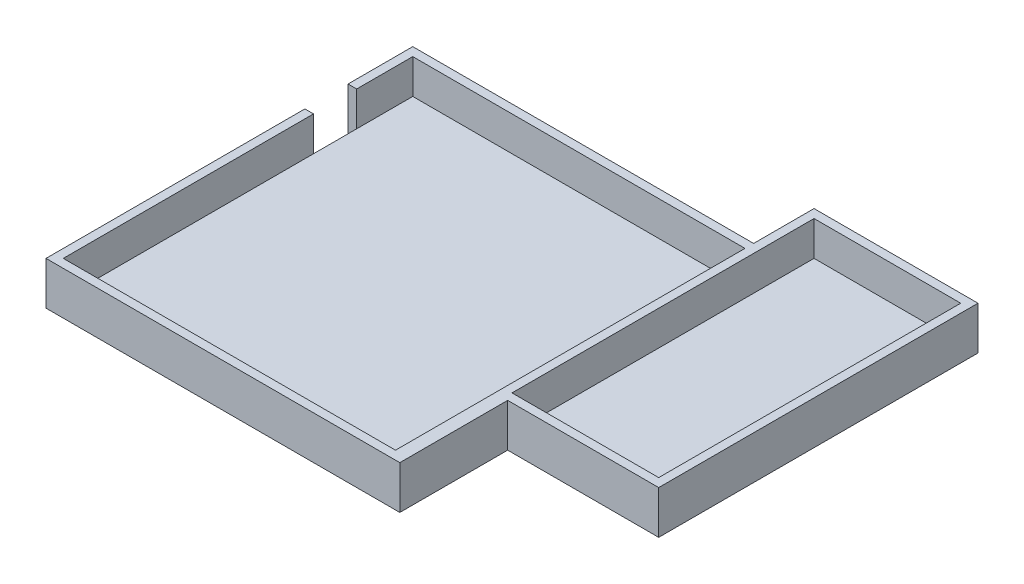
ISO-10303-21;
HEADER;
FILE_DESCRIPTION(('STEP AP214'),'2;1');
FILE_NAME('part.step','',(''),(''),'','','');
FILE_SCHEMA(('AUTOMOTIVE_DESIGN { 1 0 10303 214 1 1 1 1 }'));
ENDSEC;
DATA;
#1=APPLICATION_CONTEXT('core data for automotive mechanical design processes');
#2=APPLICATION_PROTOCOL_DEFINITION('international standard','automotive_design',2000,#1);
#3=PRODUCT_CONTEXT('',#1,'mechanical');
#4=PRODUCT('Part','Part','',(#3));
#5=PRODUCT_RELATED_PRODUCT_CATEGORY('part','',(#4));
#6=PRODUCT_DEFINITION_FORMATION('','',#4);
#7=PRODUCT_DEFINITION_CONTEXT('part definition',#1,'design');
#8=PRODUCT_DEFINITION('design','',#6,#7);
#9=PRODUCT_DEFINITION_SHAPE('','',#8);
#10=(LENGTH_UNIT() NAMED_UNIT(*) SI_UNIT(.MILLI.,.METRE.));
#11=(NAMED_UNIT(*) PLANE_ANGLE_UNIT() SI_UNIT($,.RADIAN.));
#12=(NAMED_UNIT(*) SI_UNIT($,.STERADIAN.) SOLID_ANGLE_UNIT());
#13=UNCERTAINTY_MEASURE_WITH_UNIT(LENGTH_MEASURE(1.E-05),#10,'distance_accuracy_value','');
#14=(GEOMETRIC_REPRESENTATION_CONTEXT(3) GLOBAL_UNCERTAINTY_ASSIGNED_CONTEXT((#13)) GLOBAL_UNIT_ASSIGNED_CONTEXT((#10,
#11,#12)) REPRESENTATION_CONTEXT('',''));
#15=CARTESIAN_POINT('',(0.,0.,0.));
#16=DIRECTION('',(0.,0.,1.));
#17=DIRECTION('',(1.,0.,0.));
#18=AXIS2_PLACEMENT_3D('',#15,#16,#17);
#19=CARTESIAN_POINT('',(-55.5,2.,-31.));
#20=DIRECTION('',(-1.,0.,0.));
#21=DIRECTION('',(0.,0.,1.));
#22=AXIS2_PLACEMENT_3D('',#19,#20,#21);
#23=PLANE('',#22);
#24=DIRECTION('',(0.,0.,1.));
#25=VECTOR('',#24,1.);
#26=CARTESIAN_POINT('',(-55.5,10.,-31.));
#27=LINE('',#26,#25);
#28=CARTESIAN_POINT('',(-55.5,10.,-31.));
#29=VERTEX_POINT('',#28);
#30=CARTESIAN_POINT('',(-55.5,10.,-18.));
#31=VERTEX_POINT('',#30);
#32=EDGE_CURVE('E267',#29,#31,#27,.T.);
#33=ORIENTED_EDGE('',*,*,#32,.T.);
#34=DIRECTION('',(0.,-1.,0.));
#35=VECTOR('',#34,1.);
#36=CARTESIAN_POINT('',(-55.5,10.,-18.));
#37=LINE('',#36,#35);
#38=CARTESIAN_POINT('',(-55.5,2.,-18.));
#39=VERTEX_POINT('',#38);
#40=EDGE_CURVE('E194',#31,#39,#37,.T.);
#41=ORIENTED_EDGE('',*,*,#40,.T.);
#42=DIRECTION('',(0.,0.,1.));
#43=VECTOR('',#42,1.);
#44=CARTESIAN_POINT('',(-55.5,2.,-31.));
#45=LINE('',#44,#43);
#46=CARTESIAN_POINT('',(-55.5,2.,-31.));
#47=VERTEX_POINT('',#46);
#48=EDGE_CURVE('E253',#47,#39,#45,.T.);
#49=ORIENTED_EDGE('',*,*,#48,.F.);
#50=DIRECTION('',(0.,1.,0.));
#51=VECTOR('',#50,1.);
#52=CARTESIAN_POINT('',(-55.5,2.,-31.));
#53=LINE('',#52,#51);
#54=EDGE_CURVE('E279',#47,#29,#53,.T.);
#55=ORIENTED_EDGE('',*,*,#54,.T.);
#56=EDGE_LOOP('',(#33,#41,#49,#55));
#57=FACE_BOUND('',#56,.T.);
#58=ADVANCED_FACE('F38',(#57),#23,.F.);
#59=CARTESIAN_POINT('',(-57.5,0.,-33.));
#60=DIRECTION('',(1.,0.,0.));
#61=DIRECTION('',(0.,0.,-1.));
#62=AXIS2_PLACEMENT_3D('',#59,#60,#61);
#63=PLANE('',#62);
#64=DIRECTION('',(0.,0.,-1.));
#65=VECTOR('',#64,1.);
#66=CARTESIAN_POINT('',(-57.5,0.,-33.));
#67=LINE('',#66,#65);
#68=CARTESIAN_POINT('',(-57.5,0.,-18.));
#69=VERTEX_POINT('',#68);
#70=CARTESIAN_POINT('',(-57.5,0.,-33.));
#71=VERTEX_POINT('',#70);
#72=EDGE_CURVE('E63',#69,#71,#67,.T.);
#73=ORIENTED_EDGE('',*,*,#72,.F.);
#74=DIRECTION('',(0.,-1.,0.));
#75=VECTOR('',#74,1.);
#76=CARTESIAN_POINT('',(-57.5,10.,-18.));
#77=LINE('',#76,#75);
#78=CARTESIAN_POINT('',(-57.5,10.,-18.));
#79=VERTEX_POINT('',#78);
#80=EDGE_CURVE('E200',#79,#69,#77,.T.);
#81=ORIENTED_EDGE('',*,*,#80,.F.);
#82=DIRECTION('',(0.,0.,-1.));
#83=VECTOR('',#82,1.);
#84=CARTESIAN_POINT('',(-57.5,10.,-33.));
#85=LINE('',#84,#83);
#86=CARTESIAN_POINT('',(-57.5,10.,-33.));
#87=VERTEX_POINT('',#86);
#88=EDGE_CURVE('E214',#79,#87,#85,.T.);
#89=ORIENTED_EDGE('',*,*,#88,.T.);
#90=DIRECTION('',(0.,1.,0.));
#91=VECTOR('',#90,1.);
#92=CARTESIAN_POINT('',(-57.5,0.,-33.));
#93=LINE('',#92,#91);
#94=EDGE_CURVE('E249',#71,#87,#93,.T.);
#95=ORIENTED_EDGE('',*,*,#94,.F.);
#96=EDGE_LOOP('',(#73,#81,#89,#95));
#97=FACE_BOUND('',#96,.T.);
#98=ADVANCED_FACE('F390',(#97),#63,.F.);
#99=CARTESIAN_POINT('',(59.5,10.,52.));
#100=DIRECTION('',(-1.,0.,0.));
#101=DIRECTION('',(0.,0.,1.));
#102=AXIS2_PLACEMENT_3D('',#99,#100,#101);
#103=PLANE('',#102);
#104=DIRECTION('',(0.,0.,-1.));
#105=VECTOR('',#104,1.);
#106=CARTESIAN_POINT('',(59.5,0.,52.));
#107=LINE('',#106,#105);
#108=CARTESIAN_POINT('',(59.5,0.,27.));
#109=VERTEX_POINT('',#108);
#110=CARTESIAN_POINT('',(59.5,0.,-47.));
#111=VERTEX_POINT('',#110);
#112=EDGE_CURVE('E335',#109,#111,#107,.T.);
#113=ORIENTED_EDGE('',*,*,#112,.T.);
#114=DIRECTION('',(0.,1.,0.));
#115=VECTOR('',#114,1.);
#116=CARTESIAN_POINT('',(59.5,0.,-47.));
#117=LINE('',#116,#115);
#118=CARTESIAN_POINT('',(59.5,10.,-47.));
#119=VERTEX_POINT('',#118);
#120=EDGE_CURVE('E241',#111,#119,#117,.T.);
#121=ORIENTED_EDGE('',*,*,#120,.T.);
#122=DIRECTION('',(0.,0.,-1.));
#123=VECTOR('',#122,1.);
#124=CARTESIAN_POINT('',(59.5,10.,52.));
#125=LINE('',#124,#123);
#126=CARTESIAN_POINT('',(59.5,10.,27.));
#127=VERTEX_POINT('',#126);
#128=EDGE_CURVE('E47',#127,#119,#125,.T.);
#129=ORIENTED_EDGE('',*,*,#128,.F.);
#130=DIRECTION('',(0.,1.,0.));
#131=VECTOR('',#130,1.);
#132=CARTESIAN_POINT('',(59.5,0.,27.));
#133=LINE('',#132,#131);
#134=EDGE_CURVE('E327',#109,#127,#133,.T.);
#135=ORIENTED_EDGE('',*,*,#134,.F.);
#136=EDGE_LOOP('',(#113,#121,#129,#135));
#137=FACE_BOUND('',#136,.T.);
#138=ADVANCED_FACE('F40',(#137),#103,.F.);
#139=CARTESIAN_POINT('',(-59.5,10.,52.));
#140=DIRECTION('',(0.,0.,-1.));
#141=DIRECTION('',(-1.,0.,0.));
#142=AXIS2_PLACEMENT_3D('',#139,#140,#141);
#143=PLANE('',#142);
#144=DIRECTION('',(1.,0.,0.));
#145=VECTOR('',#144,1.);
#146=CARTESIAN_POINT('',(-59.5,10.,52.));
#147=LINE('',#146,#145);
#148=CARTESIAN_POINT('',(-57.5,10.,52.));
#149=VERTEX_POINT('',#148);
#150=CARTESIAN_POINT('',(24.5,10.,52.));
#151=VERTEX_POINT('',#150);
#152=EDGE_CURVE('E11',#149,#151,#147,.T.);
#153=ORIENTED_EDGE('',*,*,#152,.F.);
#154=DIRECTION('',(0.,1.,0.));
#155=VECTOR('',#154,1.);
#156=CARTESIAN_POINT('',(-57.5,0.,52.));
#157=LINE('',#156,#155);
#158=CARTESIAN_POINT('',(-57.5,0.,52.));
#159=VERTEX_POINT('',#158);
#160=EDGE_CURVE('E229',#159,#149,#157,.T.);
#161=ORIENTED_EDGE('',*,*,#160,.F.);
#162=DIRECTION('',(1.,0.,0.));
#163=VECTOR('',#162,1.);
#164=CARTESIAN_POINT('',(-59.5,0.,52.));
#165=LINE('',#164,#163);
#166=CARTESIAN_POINT('',(24.5,0.,52.));
#167=VERTEX_POINT('',#166);
#168=EDGE_CURVE('E42',#159,#167,#165,.T.);
#169=ORIENTED_EDGE('',*,*,#168,.T.);
#170=DIRECTION('',(0.,1.,0.));
#171=VECTOR('',#170,1.);
#172=CARTESIAN_POINT('',(24.5,0.,52.));
#173=LINE('',#172,#171);
#174=EDGE_CURVE('E332',#167,#151,#173,.T.);
#175=ORIENTED_EDGE('',*,*,#174,.T.);
#176=EDGE_LOOP('',(#153,#161,#169,#175));
#177=FACE_BOUND('',#176,.T.);
#178=ADVANCED_FACE('F349',(#177),#143,.F.);
#179=CARTESIAN_POINT('',(0.,10.,0.));
#180=DIRECTION('',(0.,-1.,0.));
#181=DIRECTION('',(0.,0.,-1.));
#182=AXIS2_PLACEMENT_3D('',#179,#180,#181);
#183=PLANE('',#182);
#184=ORIENTED_EDGE('',*,*,#88,.F.);
#185=DIRECTION('',(-1.,0.,0.));
#186=VECTOR('',#185,1.);
#187=CARTESIAN_POINT('',(-55.5,10.,-18.));
#188=LINE('',#187,#186);
#189=EDGE_CURVE('E212',#31,#79,#188,.T.);
#190=ORIENTED_EDGE('',*,*,#189,.F.);
#191=ORIENTED_EDGE('',*,*,#32,.F.);
#192=DIRECTION('',(-1.,0.,0.));
#193=VECTOR('',#192,1.);
#194=CARTESIAN_POINT('',(-55.5,10.,-31.));
#195=LINE('',#194,#193);
#196=CARTESIAN_POINT('',(21.5,10.,-31.));
#197=VERTEX_POINT('',#196);
#198=EDGE_CURVE('E276',#197,#29,#195,.T.);
#199=ORIENTED_EDGE('',*,*,#198,.F.);
#200=DIRECTION('',(0.,0.,-1.));
#201=VECTOR('',#200,1.);
#202=CARTESIAN_POINT('',(21.5,10.,-31.));
#203=LINE('',#202,#201);
#204=CARTESIAN_POINT('',(21.5,10.,50.));
#205=VERTEX_POINT('',#204);
#206=EDGE_CURVE('E273',#205,#197,#203,.T.);
#207=ORIENTED_EDGE('',*,*,#206,.F.);
#208=DIRECTION('',(1.,0.,0.));
#209=VECTOR('',#208,1.);
#210=CARTESIAN_POINT('',(-55.5,10.,50.));
#211=LINE('',#210,#209);
#212=CARTESIAN_POINT('',(-55.5,10.,50.));
#213=VERTEX_POINT('',#212);
#214=EDGE_CURVE('E270',#213,#205,#211,.T.);
#215=ORIENTED_EDGE('',*,*,#214,.F.);
#216=CARTESIAN_POINT('',(-55.5,10.,-8.00000000000001));
#217=VERTEX_POINT('',#216);
#218=EDGE_CURVE('E244',#217,#213,#27,.T.);
#219=ORIENTED_EDGE('',*,*,#218,.F.);
#220=DIRECTION('',(-1.,0.,0.));
#221=VECTOR('',#220,1.);
#222=CARTESIAN_POINT('',(-55.5,10.,-8.00000000000001));
#223=LINE('',#222,#221);
#224=CARTESIAN_POINT('',(-57.5,10.,-8.00000000000001));
#225=VERTEX_POINT('',#224);
#226=EDGE_CURVE('E215',#217,#225,#223,.T.);
#227=ORIENTED_EDGE('',*,*,#226,.T.);
#228=EDGE_CURVE('E230',#149,#225,#85,.T.);
#229=ORIENTED_EDGE('',*,*,#228,.F.);
#230=ORIENTED_EDGE('',*,*,#152,.T.);
#231=DIRECTION('',(0.,0.,1.));
#232=VECTOR('',#231,1.);
#233=CARTESIAN_POINT('',(24.5,10.,52.));
#234=LINE('',#233,#232);
#235=CARTESIAN_POINT('',(24.5,10.,27.));
#236=VERTEX_POINT('',#235);
#237=EDGE_CURVE('E324',#236,#151,#234,.T.);
#238=ORIENTED_EDGE('',*,*,#237,.F.);
#239=DIRECTION('',(-1.,0.,0.));
#240=VECTOR('',#239,1.);
#241=CARTESIAN_POINT('',(59.5,10.,27.));
#242=LINE('',#241,#240);
#243=EDGE_CURVE('E313',#127,#236,#242,.T.);
#244=ORIENTED_EDGE('',*,*,#243,.F.);
#245=ORIENTED_EDGE('',*,*,#128,.T.);
#246=DIRECTION('',(1.,0.,0.));
#247=VECTOR('',#246,1.);
#248=CARTESIAN_POINT('',(59.5,10.,-47.));
#249=LINE('',#248,#247);
#250=CARTESIAN_POINT('',(21.5,10.,-47.));
#251=VERTEX_POINT('',#250);
#252=EDGE_CURVE('E239',#251,#119,#249,.T.);
#253=ORIENTED_EDGE('',*,*,#252,.F.);
#254=DIRECTION('',(0.,0.,-1.));
#255=VECTOR('',#254,1.);
#256=CARTESIAN_POINT('',(21.5,10.,-47.));
#257=LINE('',#256,#255);
#258=CARTESIAN_POINT('',(21.5,10.,-33.));
#259=VERTEX_POINT('',#258);
#260=EDGE_CURVE('E236',#259,#251,#257,.T.);
#261=ORIENTED_EDGE('',*,*,#260,.F.);
#262=DIRECTION('',(1.,0.,0.));
#263=VECTOR('',#262,1.);
#264=CARTESIAN_POINT('',(21.5,10.,-33.));
#265=LINE('',#264,#263);
#266=EDGE_CURVE('E233',#87,#259,#265,.T.);
#267=ORIENTED_EDGE('',*,*,#266,.F.);
#268=EDGE_LOOP('',(#184,#190,#191,#199,#207,#215,#219,#227,#229,#230,#238,#244,#245,#253,#261,#267));
#269=FACE_BOUND('',#268,.T.);
#270=DIRECTION('',(-1.,0.,0.));
#271=VECTOR('',#270,1.);
#272=CARTESIAN_POINT('',(57.5,10.,-45.));
#273=LINE('',#272,#271);
#274=CARTESIAN_POINT('',(57.5,10.,-45.));
#275=VERTEX_POINT('',#274);
#276=CARTESIAN_POINT('',(23.5,10.,-45.));
#277=VERTEX_POINT('',#276);
#278=EDGE_CURVE('E303',#275,#277,#273,.T.);
#279=ORIENTED_EDGE('',*,*,#278,.F.);
#280=DIRECTION('',(0.,0.,-1.));
#281=VECTOR('',#280,1.);
#282=CARTESIAN_POINT('',(57.5,10.,25.));
#283=LINE('',#282,#281);
#284=CARTESIAN_POINT('',(57.5,10.,25.));
#285=VERTEX_POINT('',#284);
#286=EDGE_CURVE('E281',#285,#275,#283,.T.);
#287=ORIENTED_EDGE('',*,*,#286,.F.);
#288=DIRECTION('',(1.,0.,0.));
#289=VECTOR('',#288,1.);
#290=CARTESIAN_POINT('',(57.5,10.,25.));
#291=LINE('',#290,#289);
#292=CARTESIAN_POINT('',(23.5,10.,25.));
#293=VERTEX_POINT('',#292);
#294=EDGE_CURVE('E292',#293,#285,#291,.T.);
#295=ORIENTED_EDGE('',*,*,#294,.F.);
#296=DIRECTION('',(0.,0.,1.));
#297=VECTOR('',#296,1.);
#298=CARTESIAN_POINT('',(23.5,10.,25.));
#299=LINE('',#298,#297);
#300=EDGE_CURVE('E306',#277,#293,#299,.T.);
#301=ORIENTED_EDGE('',*,*,#300,.F.);
#302=EDGE_LOOP('',(#279,#287,#295,#301));
#303=FACE_BOUND('',#302,.T.);
#304=ADVANCED_FACE('F361',(#269,#303),#183,.F.);
#305=CARTESIAN_POINT('',(0.,0.,0.));
#306=DIRECTION('',(0.,-1.,0.));
#307=DIRECTION('',(0.,0.,-1.));
#308=AXIS2_PLACEMENT_3D('',#305,#306,#307);
#309=PLANE('',#308);
#310=DIRECTION('',(-1.,0.,0.));
#311=VECTOR('',#310,1.);
#312=CARTESIAN_POINT('',(-55.5,0.,-18.));
#313=LINE('',#312,#311);
#314=CARTESIAN_POINT('',(-55.5,0.,-18.));
#315=VERTEX_POINT('',#314);
#316=EDGE_CURVE('E197',#315,#69,#313,.T.);
#317=ORIENTED_EDGE('',*,*,#316,.T.);
#318=ORIENTED_EDGE('',*,*,#72,.T.);
#319=DIRECTION('',(1.,0.,0.));
#320=VECTOR('',#319,1.);
#321=CARTESIAN_POINT('',(21.5,0.,-33.));
#322=LINE('',#321,#320);
#323=CARTESIAN_POINT('',(21.5,0.,-33.));
#324=VERTEX_POINT('',#323);
#325=EDGE_CURVE('E221',#71,#324,#322,.T.);
#326=ORIENTED_EDGE('',*,*,#325,.T.);
#327=DIRECTION('',(0.,0.,-1.));
#328=VECTOR('',#327,1.);
#329=CARTESIAN_POINT('',(21.5,0.,-47.));
#330=LINE('',#329,#328);
#331=CARTESIAN_POINT('',(21.5,0.,-47.));
#332=VERTEX_POINT('',#331);
#333=EDGE_CURVE('E223',#324,#332,#330,.T.);
#334=ORIENTED_EDGE('',*,*,#333,.T.);
#335=DIRECTION('',(1.,0.,0.));
#336=VECTOR('',#335,1.);
#337=CARTESIAN_POINT('',(59.5,0.,-47.));
#338=LINE('',#337,#336);
#339=EDGE_CURVE('E226',#332,#111,#338,.T.);
#340=ORIENTED_EDGE('',*,*,#339,.T.);
#341=ORIENTED_EDGE('',*,*,#112,.F.);
#342=DIRECTION('',(-1.,0.,0.));
#343=VECTOR('',#342,1.);
#344=CARTESIAN_POINT('',(59.5,0.,27.));
#345=LINE('',#344,#343);
#346=CARTESIAN_POINT('',(24.5,0.,27.));
#347=VERTEX_POINT('',#346);
#348=EDGE_CURVE('E320',#109,#347,#345,.T.);
#349=ORIENTED_EDGE('',*,*,#348,.T.);
#350=DIRECTION('',(0.,0.,1.));
#351=VECTOR('',#350,1.);
#352=CARTESIAN_POINT('',(24.5,0.,52.));
#353=LINE('',#352,#351);
#354=EDGE_CURVE('E323',#347,#167,#353,.T.);
#355=ORIENTED_EDGE('',*,*,#354,.T.);
#356=ORIENTED_EDGE('',*,*,#168,.F.);
#357=CARTESIAN_POINT('',(-57.5,0.,-8.00000000000001));
#358=VERTEX_POINT('',#357);
#359=EDGE_CURVE('E219',#159,#358,#67,.T.);
#360=ORIENTED_EDGE('',*,*,#359,.T.);
#361=DIRECTION('',(-1.,0.,0.));
#362=VECTOR('',#361,1.);
#363=CARTESIAN_POINT('',(-55.5,0.,-8.00000000000001));
#364=LINE('',#363,#362);
#365=CARTESIAN_POINT('',(-55.5,0.,-8.00000000000001));
#366=VERTEX_POINT('',#365);
#367=EDGE_CURVE('E55',#366,#358,#364,.T.);
#368=ORIENTED_EDGE('',*,*,#367,.F.);
#369=DIRECTION('',(0.,0.,1.));
#370=VECTOR('',#369,1.);
#371=CARTESIAN_POINT('',(-55.5,0.,-18.));
#372=LINE('',#371,#370);
#373=EDGE_CURVE('E189',#315,#366,#372,.T.);
#374=ORIENTED_EDGE('',*,*,#373,.F.);
#375=EDGE_LOOP('',(#317,#318,#326,#334,#340,#341,#349,#355,#356,#360,#368,#374));
#376=FACE_BOUND('',#375,.T.);
#377=ADVANCED_FACE('F203',(#376),#309,.T.);
#378=CARTESIAN_POINT('',(24.5,0.,52.));
#379=DIRECTION('',(-1.,0.,0.));
#380=DIRECTION('',(0.,0.,1.));
#381=AXIS2_PLACEMENT_3D('',#378,#379,#380);
#382=PLANE('',#381);
#383=ORIENTED_EDGE('',*,*,#237,.T.);
#384=ORIENTED_EDGE('',*,*,#174,.F.);
#385=ORIENTED_EDGE('',*,*,#354,.F.);
#386=DIRECTION('',(0.,1.,0.));
#387=VECTOR('',#386,1.);
#388=CARTESIAN_POINT('',(24.5,0.,27.));
#389=LINE('',#388,#387);
#390=EDGE_CURVE('E336',#347,#236,#389,.T.);
#391=ORIENTED_EDGE('',*,*,#390,.T.);
#392=EDGE_LOOP('',(#383,#384,#385,#391));
#393=FACE_BOUND('',#392,.T.);
#394=ADVANCED_FACE('F351',(#393),#382,.F.);
#395=CARTESIAN_POINT('',(59.5,0.,27.));
#396=DIRECTION('',(0.,0.,-1.));
#397=DIRECTION('',(-1.,0.,0.));
#398=AXIS2_PLACEMENT_3D('',#395,#396,#397);
#399=PLANE('',#398);
#400=ORIENTED_EDGE('',*,*,#243,.T.);
#401=ORIENTED_EDGE('',*,*,#390,.F.);
#402=ORIENTED_EDGE('',*,*,#348,.F.);
#403=ORIENTED_EDGE('',*,*,#134,.T.);
#404=EDGE_LOOP('',(#400,#401,#402,#403));
#405=FACE_BOUND('',#404,.T.);
#406=ADVANCED_FACE('F355',(#405),#399,.F.);
#407=CARTESIAN_POINT('',(57.5,2.,25.));
#408=DIRECTION('',(1.,0.,0.));
#409=DIRECTION('',(0.,0.,-1.));
#410=AXIS2_PLACEMENT_3D('',#407,#408,#409);
#411=PLANE('',#410);
#412=ORIENTED_EDGE('',*,*,#286,.T.);
#413=DIRECTION('',(0.,1.,0.));
#414=VECTOR('',#413,1.);
#415=CARTESIAN_POINT('',(57.5,2.,-45.));
#416=LINE('',#415,#414);
#417=CARTESIAN_POINT('',(57.5,2.,-45.));
#418=VERTEX_POINT('',#417);
#419=EDGE_CURVE('E301',#418,#275,#416,.T.);
#420=ORIENTED_EDGE('',*,*,#419,.F.);
#421=DIRECTION('',(0.,0.,-1.));
#422=VECTOR('',#421,1.);
#423=CARTESIAN_POINT('',(57.5,2.,25.));
#424=LINE('',#423,#422);
#425=CARTESIAN_POINT('',(57.5,2.,25.));
#426=VERTEX_POINT('',#425);
#427=EDGE_CURVE('E288',#426,#418,#424,.T.);
#428=ORIENTED_EDGE('',*,*,#427,.F.);
#429=DIRECTION('',(0.,1.,0.));
#430=VECTOR('',#429,1.);
#431=CARTESIAN_POINT('',(57.5,2.,25.));
#432=LINE('',#431,#430);
#433=EDGE_CURVE('E311',#426,#285,#432,.T.);
#434=ORIENTED_EDGE('',*,*,#433,.T.);
#435=EDGE_LOOP('',(#412,#420,#428,#434));
#436=FACE_BOUND('',#435,.T.);
#437=ADVANCED_FACE('F438',(#436),#411,.F.);
#438=CARTESIAN_POINT('',(57.5,2.,25.));
#439=DIRECTION('',(0.,0.,1.));
#440=DIRECTION('',(1.,0.,0.));
#441=AXIS2_PLACEMENT_3D('',#438,#439,#440);
#442=PLANE('',#441);
#443=ORIENTED_EDGE('',*,*,#294,.T.);
#444=ORIENTED_EDGE('',*,*,#433,.F.);
#445=DIRECTION('',(1.,0.,0.));
#446=VECTOR('',#445,1.);
#447=CARTESIAN_POINT('',(57.5,2.,25.));
#448=LINE('',#447,#446);
#449=CARTESIAN_POINT('',(23.5,2.,25.));
#450=VERTEX_POINT('',#449);
#451=EDGE_CURVE('E298',#450,#426,#448,.T.);
#452=ORIENTED_EDGE('',*,*,#451,.F.);
#453=DIRECTION('',(0.,1.,0.));
#454=VECTOR('',#453,1.);
#455=CARTESIAN_POINT('',(23.5,2.,25.));
#456=LINE('',#455,#454);
#457=EDGE_CURVE('E314',#450,#293,#456,.T.);
#458=ORIENTED_EDGE('',*,*,#457,.T.);
#459=EDGE_LOOP('',(#443,#444,#452,#458));
#460=FACE_BOUND('',#459,.T.);
#461=ADVANCED_FACE('F435',(#460),#442,.F.);
#462=CARTESIAN_POINT('',(23.5,2.,25.));
#463=DIRECTION('',(-1.,0.,0.));
#464=DIRECTION('',(0.,0.,1.));
#465=AXIS2_PLACEMENT_3D('',#462,#463,#464);
#466=PLANE('',#465);
#467=ORIENTED_EDGE('',*,*,#300,.T.);
#468=ORIENTED_EDGE('',*,*,#457,.F.);
#469=DIRECTION('',(0.,0.,1.));
#470=VECTOR('',#469,1.);
#471=CARTESIAN_POINT('',(23.5,2.,25.));
#472=LINE('',#471,#470);
#473=CARTESIAN_POINT('',(23.5,2.,-45.));
#474=VERTEX_POINT('',#473);
#475=EDGE_CURVE('E295',#474,#450,#472,.T.);
#476=ORIENTED_EDGE('',*,*,#475,.F.);
#477=DIRECTION('',(0.,1.,0.));
#478=VECTOR('',#477,1.);
#479=CARTESIAN_POINT('',(23.5,2.,-45.));
#480=LINE('',#479,#478);
#481=EDGE_CURVE('E316',#474,#277,#480,.T.);
#482=ORIENTED_EDGE('',*,*,#481,.T.);
#483=EDGE_LOOP('',(#467,#468,#476,#482));
#484=FACE_BOUND('',#483,.T.);
#485=ADVANCED_FACE('F431',(#484),#466,.F.);
#486=CARTESIAN_POINT('',(57.5,2.,-45.));
#487=DIRECTION('',(0.,0.,-1.));
#488=DIRECTION('',(-1.,0.,0.));
#489=AXIS2_PLACEMENT_3D('',#486,#487,#488);
#490=PLANE('',#489);
#491=ORIENTED_EDGE('',*,*,#278,.T.);
#492=ORIENTED_EDGE('',*,*,#481,.F.);
#493=DIRECTION('',(-1.,0.,0.));
#494=VECTOR('',#493,1.);
#495=CARTESIAN_POINT('',(57.5,2.,-45.));
#496=LINE('',#495,#494);
#497=EDGE_CURVE('E291',#418,#474,#496,.T.);
#498=ORIENTED_EDGE('',*,*,#497,.F.);
#499=ORIENTED_EDGE('',*,*,#419,.T.);
#500=EDGE_LOOP('',(#491,#492,#498,#499));
#501=FACE_BOUND('',#500,.T.);
#502=ADVANCED_FACE('F426',(#501),#490,.F.);
#503=CARTESIAN_POINT('',(0.,2.,0.));
#504=DIRECTION('',(0.,1.,0.));
#505=DIRECTION('',(0.,0.,1.));
#506=AXIS2_PLACEMENT_3D('',#503,#504,#505);
#507=PLANE('',#506);
#508=ORIENTED_EDGE('',*,*,#427,.T.);
#509=ORIENTED_EDGE('',*,*,#497,.T.);
#510=ORIENTED_EDGE('',*,*,#475,.T.);
#511=ORIENTED_EDGE('',*,*,#451,.T.);
#512=EDGE_LOOP('',(#508,#509,#510,#511));
#513=FACE_BOUND('',#512,.T.);
#514=ADVANCED_FACE('F418',(#513),#507,.T.);
#515=CARTESIAN_POINT('',(-55.5,2.,-8.00000000000001));
#516=VERTEX_POINT('',#515);
#517=CARTESIAN_POINT('',(-55.5,2.,50.));
#518=VERTEX_POINT('',#517);
#519=EDGE_CURVE('E257',#516,#518,#45,.T.);
#520=ORIENTED_EDGE('',*,*,#519,.F.);
#521=DIRECTION('',(0.,1.,0.));
#522=VECTOR('',#521,1.);
#523=CARTESIAN_POINT('',(-55.5,10.,-8.00000000000001));
#524=LINE('',#523,#522);
#525=EDGE_CURVE('E205',#516,#217,#524,.T.);
#526=ORIENTED_EDGE('',*,*,#525,.T.);
#527=ORIENTED_EDGE('',*,*,#218,.T.);
#528=DIRECTION('',(0.,1.,0.));
#529=VECTOR('',#528,1.);
#530=CARTESIAN_POINT('',(-55.5,2.,50.));
#531=LINE('',#530,#529);
#532=EDGE_CURVE('E266',#518,#213,#531,.T.);
#533=ORIENTED_EDGE('',*,*,#532,.F.);
#534=EDGE_LOOP('',(#520,#526,#527,#533));
#535=FACE_BOUND('',#534,.T.);
#536=ADVANCED_FACE('F371',(#535),#23,.F.);
#537=CARTESIAN_POINT('',(-55.5,2.,-31.));
#538=DIRECTION('',(0.,0.,-1.));
#539=DIRECTION('',(-1.,0.,0.));
#540=AXIS2_PLACEMENT_3D('',#537,#538,#539);
#541=PLANE('',#540);
#542=ORIENTED_EDGE('',*,*,#198,.T.);
#543=ORIENTED_EDGE('',*,*,#54,.F.);
#544=DIRECTION('',(-1.,0.,0.));
#545=VECTOR('',#544,1.);
#546=CARTESIAN_POINT('',(-55.5,2.,-31.));
#547=LINE('',#546,#545);
#548=CARTESIAN_POINT('',(21.5,2.,-31.));
#549=VERTEX_POINT('',#548);
#550=EDGE_CURVE('E263',#549,#47,#547,.T.);
#551=ORIENTED_EDGE('',*,*,#550,.F.);
#552=DIRECTION('',(0.,1.,0.));
#553=VECTOR('',#552,1.);
#554=CARTESIAN_POINT('',(21.5,2.,-31.));
#555=LINE('',#554,#553);
#556=EDGE_CURVE('E282',#549,#197,#555,.T.);
#557=ORIENTED_EDGE('',*,*,#556,.T.);
#558=EDGE_LOOP('',(#542,#543,#551,#557));
#559=FACE_BOUND('',#558,.T.);
#560=ADVANCED_FACE('F417',(#559),#541,.F.);
#561=CARTESIAN_POINT('',(21.5,2.,-31.));
#562=DIRECTION('',(1.,0.,0.));
#563=DIRECTION('',(0.,0.,-1.));
#564=AXIS2_PLACEMENT_3D('',#561,#562,#563);
#565=PLANE('',#564);
#566=ORIENTED_EDGE('',*,*,#206,.T.);
#567=ORIENTED_EDGE('',*,*,#556,.F.);
#568=DIRECTION('',(0.,0.,-1.));
#569=VECTOR('',#568,1.);
#570=CARTESIAN_POINT('',(21.5,2.,-31.));
#571=LINE('',#570,#569);
#572=CARTESIAN_POINT('',(21.5,2.,50.));
#573=VERTEX_POINT('',#572);
#574=EDGE_CURVE('E260',#573,#549,#571,.T.);
#575=ORIENTED_EDGE('',*,*,#574,.F.);
#576=DIRECTION('',(0.,1.,0.));
#577=VECTOR('',#576,1.);
#578=CARTESIAN_POINT('',(21.5,2.,50.));
#579=LINE('',#578,#577);
#580=EDGE_CURVE('E284',#573,#205,#579,.T.);
#581=ORIENTED_EDGE('',*,*,#580,.T.);
#582=EDGE_LOOP('',(#566,#567,#575,#581));
#583=FACE_BOUND('',#582,.T.);
#584=ADVANCED_FACE('F423',(#583),#565,.F.);
#585=CARTESIAN_POINT('',(-55.5,2.,50.));
#586=DIRECTION('',(0.,0.,1.));
#587=DIRECTION('',(1.,0.,0.));
#588=AXIS2_PLACEMENT_3D('',#585,#586,#587);
#589=PLANE('',#588);
#590=ORIENTED_EDGE('',*,*,#214,.T.);
#591=ORIENTED_EDGE('',*,*,#580,.F.);
#592=DIRECTION('',(1.,0.,0.));
#593=VECTOR('',#592,1.);
#594=CARTESIAN_POINT('',(-55.5,2.,50.));
#595=LINE('',#594,#593);
#596=EDGE_CURVE('E256',#518,#573,#595,.T.);
#597=ORIENTED_EDGE('',*,*,#596,.F.);
#598=ORIENTED_EDGE('',*,*,#532,.T.);
#599=EDGE_LOOP('',(#590,#591,#597,#598));
#600=FACE_BOUND('',#599,.T.);
#601=ADVANCED_FACE('F377',(#600),#589,.F.);
#602=CARTESIAN_POINT('',(0.,2.,0.));
#603=DIRECTION('',(0.,1.,0.));
#604=DIRECTION('',(0.,0.,1.));
#605=AXIS2_PLACEMENT_3D('',#602,#603,#604);
#606=PLANE('',#605);
#607=ORIENTED_EDGE('',*,*,#48,.T.);
#608=EDGE_CURVE('E191',#39,#516,#45,.T.);
#609=ORIENTED_EDGE('',*,*,#608,.T.);
#610=ORIENTED_EDGE('',*,*,#519,.T.);
#611=ORIENTED_EDGE('',*,*,#596,.T.);
#612=ORIENTED_EDGE('',*,*,#574,.T.);
#613=ORIENTED_EDGE('',*,*,#550,.T.);
#614=EDGE_LOOP('',(#607,#609,#610,#611,#612,#613));
#615=FACE_BOUND('',#614,.T.);
#616=ADVANCED_FACE('F381',(#615),#606,.T.);
#617=CARTESIAN_POINT('',(59.5,0.,-47.));
#618=DIRECTION('',(0.,0.,1.));
#619=DIRECTION('',(1.,0.,0.));
#620=AXIS2_PLACEMENT_3D('',#617,#618,#619);
#621=PLANE('',#620);
#622=ORIENTED_EDGE('',*,*,#252,.T.);
#623=ORIENTED_EDGE('',*,*,#120,.F.);
#624=ORIENTED_EDGE('',*,*,#339,.F.);
#625=DIRECTION('',(0.,1.,0.));
#626=VECTOR('',#625,1.);
#627=CARTESIAN_POINT('',(21.5,0.,-47.));
#628=LINE('',#627,#626);
#629=EDGE_CURVE('E245',#332,#251,#628,.T.);
#630=ORIENTED_EDGE('',*,*,#629,.T.);
#631=EDGE_LOOP('',(#622,#623,#624,#630));
#632=FACE_BOUND('',#631,.T.);
#633=ADVANCED_FACE('F398',(#632),#621,.F.);
#634=CARTESIAN_POINT('',(21.5,0.,-47.));
#635=DIRECTION('',(1.,0.,0.));
#636=DIRECTION('',(0.,0.,-1.));
#637=AXIS2_PLACEMENT_3D('',#634,#635,#636);
#638=PLANE('',#637);
#639=ORIENTED_EDGE('',*,*,#260,.T.);
#640=ORIENTED_EDGE('',*,*,#629,.F.);
#641=ORIENTED_EDGE('',*,*,#333,.F.);
#642=DIRECTION('',(0.,1.,0.));
#643=VECTOR('',#642,1.);
#644=CARTESIAN_POINT('',(21.5,0.,-33.));
#645=LINE('',#644,#643);
#646=EDGE_CURVE('E247',#324,#259,#645,.T.);
#647=ORIENTED_EDGE('',*,*,#646,.T.);
#648=EDGE_LOOP('',(#639,#640,#641,#647));
#649=FACE_BOUND('',#648,.T.);
#650=ADVANCED_FACE('F396',(#649),#638,.F.);
#651=CARTESIAN_POINT('',(21.5,0.,-33.));
#652=DIRECTION('',(0.,0.,1.));
#653=DIRECTION('',(1.,0.,0.));
#654=AXIS2_PLACEMENT_3D('',#651,#652,#653);
#655=PLANE('',#654);
#656=ORIENTED_EDGE('',*,*,#266,.T.);
#657=ORIENTED_EDGE('',*,*,#646,.F.);
#658=ORIENTED_EDGE('',*,*,#325,.F.);
#659=ORIENTED_EDGE('',*,*,#94,.T.);
#660=EDGE_LOOP('',(#656,#657,#658,#659));
#661=FACE_BOUND('',#660,.T.);
#662=ADVANCED_FACE('F392',(#661),#655,.F.);
#663=ORIENTED_EDGE('',*,*,#228,.T.);
#664=DIRECTION('',(0.,1.,0.));
#665=VECTOR('',#664,1.);
#666=CARTESIAN_POINT('',(-57.5,10.,-8.00000000000001));
#667=LINE('',#666,#665);
#668=EDGE_CURVE('E195',#358,#225,#667,.T.);
#669=ORIENTED_EDGE('',*,*,#668,.F.);
#670=ORIENTED_EDGE('',*,*,#359,.F.);
#671=ORIENTED_EDGE('',*,*,#160,.T.);
#672=EDGE_LOOP('',(#663,#669,#670,#671));
#673=FACE_BOUND('',#672,.T.);
#674=ADVANCED_FACE('F367',(#673),#63,.F.);
#675=CARTESIAN_POINT('',(-55.5,10.,-18.));
#676=DIRECTION('',(0.,0.,-1.));
#677=DIRECTION('',(0.,1.,0.));
#678=AXIS2_PLACEMENT_3D('',#675,#676,#677);
#679=PLANE('',#678);
#680=ORIENTED_EDGE('',*,*,#80,.T.);
#681=ORIENTED_EDGE('',*,*,#316,.F.);
#682=EDGE_CURVE('E184',#39,#315,#37,.T.);
#683=ORIENTED_EDGE('',*,*,#682,.F.);
#684=ORIENTED_EDGE('',*,*,#40,.F.);
#685=ORIENTED_EDGE('',*,*,#189,.T.);
#686=EDGE_LOOP('',(#680,#681,#683,#684,#685));
#687=FACE_BOUND('',#686,.T.);
#688=ADVANCED_FACE('F198',(#687),#679,.F.);
#689=CARTESIAN_POINT('',(-55.5,10.,-8.00000000000001));
#690=DIRECTION('',(0.,0.,1.));
#691=DIRECTION('',(1.,0.,0.));
#692=AXIS2_PLACEMENT_3D('',#689,#690,#691);
#693=PLANE('',#692);
#694=ORIENTED_EDGE('',*,*,#668,.T.);
#695=ORIENTED_EDGE('',*,*,#226,.F.);
#696=ORIENTED_EDGE('',*,*,#525,.F.);
#697=EDGE_CURVE('E201',#366,#516,#524,.T.);
#698=ORIENTED_EDGE('',*,*,#697,.F.);
#699=ORIENTED_EDGE('',*,*,#367,.T.);
#700=EDGE_LOOP('',(#694,#695,#696,#698,#699));
#701=FACE_BOUND('',#700,.T.);
#702=ADVANCED_FACE('F368',(#701),#693,.F.);
#703=CARTESIAN_POINT('',(-55.5,0.,0.));
#704=DIRECTION('',(-1.,0.,0.));
#705=DIRECTION('',(0.,0.,1.));
#706=AXIS2_PLACEMENT_3D('',#703,#704,#705);
#707=PLANE('',#706);
#708=ORIENTED_EDGE('',*,*,#682,.T.);
#709=ORIENTED_EDGE('',*,*,#373,.T.);
#710=ORIENTED_EDGE('',*,*,#697,.T.);
#711=ORIENTED_EDGE('',*,*,#608,.F.);
#712=EDGE_LOOP('',(#708,#709,#710,#711));
#713=FACE_BOUND('',#712,.T.);
#714=ADVANCED_FACE('F186',(#713),#707,.T.);
#715=CLOSED_SHELL('',(#58,#98,#138,#178,#304,#377,#394,#406,#437,#461,#485,#502,#514,#536,#560,
#584,#601,#616,#633,#650,#662,#674,#688,#702,#714));
#716=MANIFOLD_SOLID_BREP('B2',#715);
#717=ADVANCED_BREP_SHAPE_REPRESENTATION('',(#18,#716),#14);
#718=SHAPE_DEFINITION_REPRESENTATION(#9,#717);
ENDSEC;
END-ISO-10303-21;
